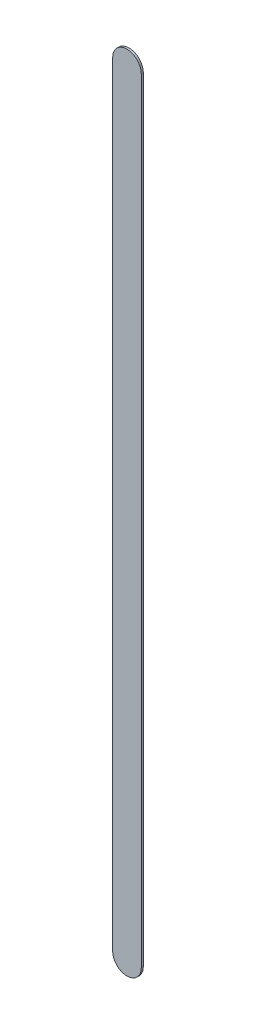
ISO-10303-21;
HEADER;
FILE_DESCRIPTION(('STEP AP214'),'2;1');
FILE_NAME('part.step','',(''),(''),'','','');
FILE_SCHEMA(('AUTOMOTIVE_DESIGN { 1 0 10303 214 1 1 1 1 }'));
ENDSEC;
DATA;
#1=APPLICATION_CONTEXT('core data for automotive mechanical design processes');
#2=APPLICATION_PROTOCOL_DEFINITION('international standard','automotive_design',2000,#1);
#3=PRODUCT_CONTEXT('',#1,'mechanical');
#4=PRODUCT('Part','Part','',(#3));
#5=PRODUCT_RELATED_PRODUCT_CATEGORY('part','',(#4));
#6=PRODUCT_DEFINITION_FORMATION('','',#4);
#7=PRODUCT_DEFINITION_CONTEXT('part definition',#1,'design');
#8=PRODUCT_DEFINITION('design','',#6,#7);
#9=PRODUCT_DEFINITION_SHAPE('','',#8);
#10=(LENGTH_UNIT() NAMED_UNIT(*) SI_UNIT(.MILLI.,.METRE.));
#11=(NAMED_UNIT(*) PLANE_ANGLE_UNIT() SI_UNIT($,.RADIAN.));
#12=(NAMED_UNIT(*) SI_UNIT($,.STERADIAN.) SOLID_ANGLE_UNIT());
#13=UNCERTAINTY_MEASURE_WITH_UNIT(LENGTH_MEASURE(1.E-05),#10,'distance_accuracy_value','');
#14=(GEOMETRIC_REPRESENTATION_CONTEXT(3) GLOBAL_UNCERTAINTY_ASSIGNED_CONTEXT((#13)) GLOBAL_UNIT_ASSIGNED_CONTEXT((#10,
#11,#12)) REPRESENTATION_CONTEXT('',''));
#15=CARTESIAN_POINT('',(0.,0.,0.));
#16=DIRECTION('',(0.,0.,1.));
#17=DIRECTION('',(1.,0.,0.));
#18=AXIS2_PLACEMENT_3D('',#15,#16,#17);
#19=CARTESIAN_POINT('',(87.92736542,94.77736696,0.));
#20=DIRECTION('',(-1.,0.,0.));
#21=DIRECTION('',(0.,1.,0.));
#22=AXIS2_PLACEMENT_3D('',#19,#20,#21);
#23=PLANE('',#22);
#24=DIRECTION('',(0.,1.,0.));
#25=VECTOR('',#24,1.);
#26=CARTESIAN_POINT('',(87.92736542,94.77736696,0.03556));
#27=LINE('',#26,#25);
#28=CARTESIAN_POINT('',(87.92736542,94.77736696,0.03556));
#29=VERTEX_POINT('',#28);
#30=CARTESIAN_POINT('',(87.92736542,108.32210492,0.03556));
#31=VERTEX_POINT('',#30);
#32=EDGE_CURVE('E11',#29,#31,#27,.T.);
#33=ORIENTED_EDGE('',*,*,#32,.F.);
#34=DIRECTION('',(0.,0.,1.));
#35=VECTOR('',#34,1.);
#36=CARTESIAN_POINT('',(87.92736542,94.77736696,0.));
#37=LINE('',#36,#35);
#38=CARTESIAN_POINT('',(87.92736542,94.77736696,0.));
#39=VERTEX_POINT('',#38);
#40=EDGE_CURVE('E24',#39,#29,#37,.T.);
#41=ORIENTED_EDGE('',*,*,#40,.F.);
#42=DIRECTION('',(0.,1.,0.));
#43=VECTOR('',#42,1.);
#44=CARTESIAN_POINT('',(87.92736542,94.77736696,0.));
#45=LINE('',#44,#43);
#46=CARTESIAN_POINT('',(87.92736542,108.32210492,0.));
#47=VERTEX_POINT('',#46);
#48=EDGE_CURVE('E75',#39,#47,#45,.T.);
#49=ORIENTED_EDGE('',*,*,#48,.T.);
#50=DIRECTION('',(0.,0.,1.));
#51=VECTOR('',#50,1.);
#52=CARTESIAN_POINT('',(87.92736542,108.32210492,0.));
#53=LINE('',#52,#51);
#54=EDGE_CURVE('E37',#47,#31,#53,.T.);
#55=ORIENTED_EDGE('',*,*,#54,.T.);
#56=EDGE_LOOP('',(#33,#41,#49,#55));
#57=FACE_BOUND('',#56,.T.);
#58=ADVANCED_FACE('F17',(#57),#23,.F.);
#59=CARTESIAN_POINT('',(87.67736592,108.32210492,0.));
#60=DIRECTION('',(0.,0.,-1.));
#61=DIRECTION('',(1.,1.13687065095746E-13,0.));
#62=AXIS2_PLACEMENT_3D('',#59,#60,#61);
#63=CYLINDRICAL_SURFACE('',#62,0.249999500000006);
#64=CARTESIAN_POINT('',(87.67736592,108.32210492,0.03556));
#65=DIRECTION('',(0.,0.,1.));
#66=DIRECTION('',(1.,1.13687065095746E-13,0.));
#67=AXIS2_PLACEMENT_3D('',#64,#65,#66);
#68=CIRCLE('',#67,0.249999500000006);
#69=CARTESIAN_POINT('',(87.42736642,108.32210492,0.03556));
#70=VERTEX_POINT('',#69);
#71=EDGE_CURVE('E83',#31,#70,#68,.T.);
#72=ORIENTED_EDGE('',*,*,#71,.F.);
#73=ORIENTED_EDGE('',*,*,#54,.F.);
#74=CARTESIAN_POINT('',(87.67736592,108.32210492,0.));
#75=DIRECTION('',(0.,0.,1.));
#76=DIRECTION('',(1.,1.13687065095746E-13,0.));
#77=AXIS2_PLACEMENT_3D('',#74,#75,#76);
#78=CIRCLE('',#77,0.249999500000006);
#79=CARTESIAN_POINT('',(87.42736642,108.32210492,0.));
#80=VERTEX_POINT('',#79);
#81=EDGE_CURVE('E81',#47,#80,#78,.T.);
#82=ORIENTED_EDGE('',*,*,#81,.T.);
#83=DIRECTION('',(0.,0.,1.));
#84=VECTOR('',#83,1.);
#85=CARTESIAN_POINT('',(87.42736642,108.32210492,0.));
#86=LINE('',#85,#84);
#87=EDGE_CURVE('E67',#80,#70,#86,.T.);
#88=ORIENTED_EDGE('',*,*,#87,.T.);
#89=EDGE_LOOP('',(#72,#73,#82,#88));
#90=FACE_BOUND('',#89,.T.);
#91=ADVANCED_FACE('F89',(#90),#63,.T.);
#92=CARTESIAN_POINT('',(87.42736642,108.32210492,0.));
#93=DIRECTION('',(1.,0.,0.));
#94=DIRECTION('',(0.,-1.,0.));
#95=AXIS2_PLACEMENT_3D('',#92,#93,#94);
#96=PLANE('',#95);
#97=DIRECTION('',(0.,-1.,0.));
#98=VECTOR('',#97,1.);
#99=CARTESIAN_POINT('',(87.42736642,108.32210492,0.03556));
#100=LINE('',#99,#98);
#101=CARTESIAN_POINT('',(87.42736642,94.77736696,0.03556));
#102=VERTEX_POINT('',#101);
#103=EDGE_CURVE('E71',#70,#102,#100,.T.);
#104=ORIENTED_EDGE('',*,*,#103,.F.);
#105=ORIENTED_EDGE('',*,*,#87,.F.);
#106=DIRECTION('',(0.,-1.,0.));
#107=VECTOR('',#106,1.);
#108=CARTESIAN_POINT('',(87.42736642,108.32210492,0.));
#109=LINE('',#108,#107);
#110=CARTESIAN_POINT('',(87.42736642,94.77736696,0.));
#111=VERTEX_POINT('',#110);
#112=EDGE_CURVE('E63',#80,#111,#109,.T.);
#113=ORIENTED_EDGE('',*,*,#112,.T.);
#114=DIRECTION('',(0.,0.,1.));
#115=VECTOR('',#114,1.);
#116=CARTESIAN_POINT('',(87.42736642,94.77736696,0.));
#117=LINE('',#116,#115);
#118=EDGE_CURVE('E53',#111,#102,#117,.T.);
#119=ORIENTED_EDGE('',*,*,#118,.T.);
#120=EDGE_LOOP('',(#104,#105,#113,#119));
#121=FACE_BOUND('',#120,.T.);
#122=ADVANCED_FACE('F66',(#121),#96,.F.);
#123=CARTESIAN_POINT('',(87.67736592,94.77736696,0.));
#124=DIRECTION('',(0.,0.,-1.));
#125=DIRECTION('',(-1.,0.,0.));
#126=AXIS2_PLACEMENT_3D('',#123,#124,#125);
#127=CYLINDRICAL_SURFACE('',#126,0.249999500000001);
#128=CARTESIAN_POINT('',(87.67736592,94.77736696,0.03556));
#129=DIRECTION('',(0.,0.,1.));
#130=DIRECTION('',(-1.,0.,0.));
#131=AXIS2_PLACEMENT_3D('',#128,#129,#130);
#132=CIRCLE('',#131,0.249999500000001);
#133=EDGE_CURVE('E59',#102,#29,#132,.T.);
#134=ORIENTED_EDGE('',*,*,#133,.F.);
#135=ORIENTED_EDGE('',*,*,#118,.F.);
#136=CARTESIAN_POINT('',(87.67736592,94.77736696,0.));
#137=DIRECTION('',(0.,0.,1.));
#138=DIRECTION('',(-1.,0.,0.));
#139=AXIS2_PLACEMENT_3D('',#136,#137,#138);
#140=CIRCLE('',#139,0.249999500000001);
#141=EDGE_CURVE('E57',#111,#39,#140,.T.);
#142=ORIENTED_EDGE('',*,*,#141,.T.);
#143=ORIENTED_EDGE('',*,*,#40,.T.);
#144=EDGE_LOOP('',(#134,#135,#142,#143));
#145=FACE_BOUND('',#144,.T.);
#146=ADVANCED_FACE('F55',(#145),#127,.T.);
#147=CARTESIAN_POINT('',(87.92736542,94.77736696,0.));
#148=DIRECTION('',(0.,0.,-1.));
#149=DIRECTION('',(-1.,0.,0.));
#150=AXIS2_PLACEMENT_3D('',#147,#148,#149);
#151=PLANE('',#150);
#152=ORIENTED_EDGE('',*,*,#141,.F.);
#153=ORIENTED_EDGE('',*,*,#112,.F.);
#154=ORIENTED_EDGE('',*,*,#81,.F.);
#155=ORIENTED_EDGE('',*,*,#48,.F.);
#156=EDGE_LOOP('',(#152,#153,#154,#155));
#157=FACE_BOUND('',#156,.T.);
#158=ADVANCED_FACE('F74',(#157),#151,.T.);
#159=CARTESIAN_POINT('',(87.92736542,94.77736696,0.03556));
#160=DIRECTION('',(0.,0.,-1.));
#161=DIRECTION('',(-1.,0.,0.));
#162=AXIS2_PLACEMENT_3D('',#159,#160,#161);
#163=PLANE('',#162);
#164=ORIENTED_EDGE('',*,*,#32,.T.);
#165=ORIENTED_EDGE('',*,*,#71,.T.);
#166=ORIENTED_EDGE('',*,*,#103,.T.);
#167=ORIENTED_EDGE('',*,*,#133,.T.);
#168=EDGE_LOOP('',(#164,#165,#166,#167));
#169=FACE_BOUND('',#168,.T.);
#170=ADVANCED_FACE('F91',(#169),#163,.F.);
#171=CLOSED_SHELL('',(#58,#91,#122,#146,#158,#170));
#172=MANIFOLD_SOLID_BREP('B1',#171);
#173=ADVANCED_BREP_SHAPE_REPRESENTATION('',(#18,#172),#14);
#174=SHAPE_DEFINITION_REPRESENTATION(#9,#173);
ENDSEC;
END-ISO-10303-21;
